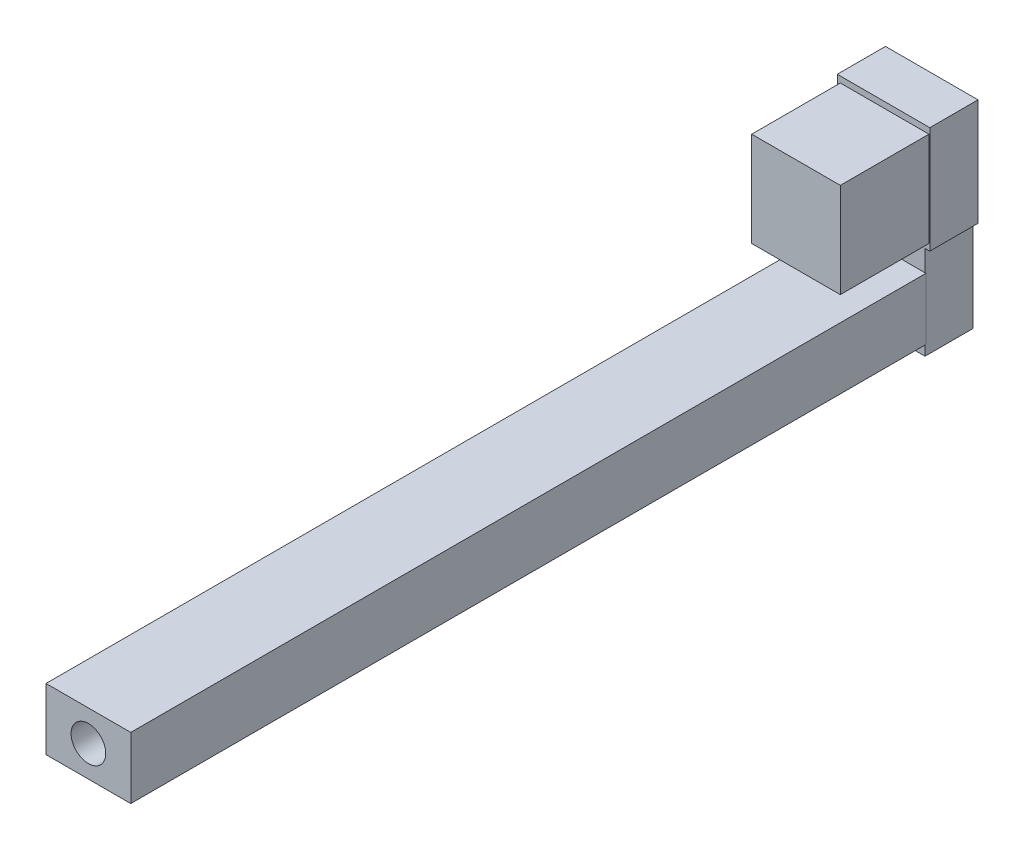
ISO-10303-21;
HEADER;
FILE_DESCRIPTION(('STEP AP214'),'2;1');
FILE_NAME('part.step','',(''),(''),'','','');
FILE_SCHEMA(('AUTOMOTIVE_DESIGN { 1 0 10303 214 1 1 1 1 }'));
ENDSEC;
DATA;
#1=APPLICATION_CONTEXT('core data for automotive mechanical design processes');
#2=APPLICATION_PROTOCOL_DEFINITION('international standard','automotive_design',2000,#1);
#3=PRODUCT_CONTEXT('',#1,'mechanical');
#4=PRODUCT('Part','Part','',(#3));
#5=PRODUCT_RELATED_PRODUCT_CATEGORY('part','',(#4));
#6=PRODUCT_DEFINITION_FORMATION('','',#4);
#7=PRODUCT_DEFINITION_CONTEXT('part definition',#1,'design');
#8=PRODUCT_DEFINITION('design','',#6,#7);
#9=PRODUCT_DEFINITION_SHAPE('','',#8);
#10=(LENGTH_UNIT() NAMED_UNIT(*) SI_UNIT(.MILLI.,.METRE.));
#11=(NAMED_UNIT(*) PLANE_ANGLE_UNIT() SI_UNIT($,.RADIAN.));
#12=(NAMED_UNIT(*) SI_UNIT($,.STERADIAN.) SOLID_ANGLE_UNIT());
#13=UNCERTAINTY_MEASURE_WITH_UNIT(LENGTH_MEASURE(1.E-05),#10,'distance_accuracy_value','');
#14=(GEOMETRIC_REPRESENTATION_CONTEXT(3) GLOBAL_UNCERTAINTY_ASSIGNED_CONTEXT((#13)) GLOBAL_UNIT_ASSIGNED_CONTEXT((#10,
#11,#12)) REPRESENTATION_CONTEXT('',''));
#15=CARTESIAN_POINT('',(0.,0.,0.));
#16=DIRECTION('',(0.,0.,1.));
#17=DIRECTION('',(1.,0.,0.));
#18=AXIS2_PLACEMENT_3D('',#15,#16,#17);
#19=CARTESIAN_POINT('',(68.326,0.,0.));
#20=DIRECTION('',(0.,0.,-1.));
#21=DIRECTION('',(0.,1.,0.));
#22=AXIS2_PLACEMENT_3D('',#19,#20,#21);
#23=PLANE('',#22);
#24=DIRECTION('',(-1.,0.,0.));
#25=VECTOR('',#24,1.);
#26=CARTESIAN_POINT('',(69.85,50.8000000000002,0.));
#27=LINE('',#26,#25);
#28=CARTESIAN_POINT('',(68.326,50.8000000000002,0.));
#29=VERTEX_POINT('',#28);
#30=CARTESIAN_POINT('',(-68.326,50.8000000000002,0.));
#31=VERTEX_POINT('',#30);
#32=EDGE_CURVE('E277',#29,#31,#27,.T.);
#33=ORIENTED_EDGE('',*,*,#32,.F.);
#34=DIRECTION('',(0.,-1.,0.));
#35=VECTOR('',#34,1.);
#36=CARTESIAN_POINT('',(68.326,85.598,0.));
#37=LINE('',#36,#35);
#38=CARTESIAN_POINT('',(68.326,85.598,0.));
#39=VERTEX_POINT('',#38);
#40=EDGE_CURVE('E228',#39,#29,#37,.T.);
#41=ORIENTED_EDGE('',*,*,#40,.F.);
#42=DIRECTION('',(-1.,0.,0.));
#43=VECTOR('',#42,1.);
#44=CARTESIAN_POINT('',(76.23,85.598,0.));
#45=LINE('',#44,#43);
#46=CARTESIAN_POINT('',(76.23,85.598,0.));
#47=VERTEX_POINT('',#46);
#48=EDGE_CURVE('E217',#47,#39,#45,.T.);
#49=ORIENTED_EDGE('',*,*,#48,.F.);
#50=DIRECTION('',(0.,-1.,0.));
#51=VECTOR('',#50,1.);
#52=CARTESIAN_POINT('',(76.23,85.598,0.));
#53=LINE('',#52,#51);
#54=CARTESIAN_POINT('',(76.23,261.868,0.));
#55=VERTEX_POINT('',#54);
#56=EDGE_CURVE('E191',#55,#47,#53,.T.);
#57=ORIENTED_EDGE('',*,*,#56,.F.);
#58=DIRECTION('',(-1.,0.,0.));
#59=VECTOR('',#58,1.);
#60=CARTESIAN_POINT('',(76.23,261.868,0.));
#61=LINE('',#60,#59);
#62=CARTESIAN_POINT('',(-76.23,261.868,0.));
#63=VERTEX_POINT('',#62);
#64=EDGE_CURVE('E200',#55,#63,#61,.T.);
#65=ORIENTED_EDGE('',*,*,#64,.T.);
#66=DIRECTION('',(0.,-1.,0.));
#67=VECTOR('',#66,1.);
#68=CARTESIAN_POINT('',(-76.23,85.598,0.));
#69=LINE('',#68,#67);
#70=CARTESIAN_POINT('',(-76.23,85.598,0.));
#71=VERTEX_POINT('',#70);
#72=EDGE_CURVE('E182',#63,#71,#69,.T.);
#73=ORIENTED_EDGE('',*,*,#72,.T.);
#74=CARTESIAN_POINT('',(-68.326,85.598,0.));
#75=VERTEX_POINT('',#74);
#76=EDGE_CURVE('E216',#75,#71,#45,.T.);
#77=ORIENTED_EDGE('',*,*,#76,.F.);
#78=DIRECTION('',(0.,-1.,0.));
#79=VECTOR('',#78,1.);
#80=CARTESIAN_POINT('',(-68.326,0.,0.));
#81=LINE('',#80,#79);
#82=EDGE_CURVE('E44',#75,#31,#81,.T.);
#83=ORIENTED_EDGE('',*,*,#82,.T.);
#84=EDGE_LOOP('',(#33,#41,#49,#57,#65,#73,#77,#83));
#85=FACE_BOUND('',#84,.T.);
#86=DIRECTION('',(0.,-1.,0.));
#87=VECTOR('',#86,1.);
#88=CARTESIAN_POINT('',(-71.23,251.868,0.));
#89=LINE('',#88,#87);
#90=CARTESIAN_POINT('',(-71.23,251.868,0.));
#91=VERTEX_POINT('',#90);
#92=CARTESIAN_POINT('',(-71.23,95.828,0.));
#93=VERTEX_POINT('',#92);
#94=EDGE_CURVE('E181',#91,#93,#89,.T.);
#95=ORIENTED_EDGE('',*,*,#94,.F.);
#96=DIRECTION('',(-1.,0.,0.));
#97=VECTOR('',#96,1.);
#98=CARTESIAN_POINT('',(-71.23,251.868,0.));
#99=LINE('',#98,#97);
#100=CARTESIAN_POINT('',(74.81,251.868,0.));
#101=VERTEX_POINT('',#100);
#102=EDGE_CURVE('E178',#101,#91,#99,.T.);
#103=ORIENTED_EDGE('',*,*,#102,.F.);
#104=DIRECTION('',(0.,1.,0.));
#105=VECTOR('',#104,1.);
#106=CARTESIAN_POINT('',(74.81,251.868,0.));
#107=LINE('',#106,#105);
#108=CARTESIAN_POINT('',(74.81,95.828,0.));
#109=VERTEX_POINT('',#108);
#110=EDGE_CURVE('E57',#109,#101,#107,.T.);
#111=ORIENTED_EDGE('',*,*,#110,.F.);
#112=DIRECTION('',(1.,0.,0.));
#113=VECTOR('',#112,1.);
#114=CARTESIAN_POINT('',(-71.23,95.828,0.));
#115=LINE('',#114,#113);
#116=EDGE_CURVE('E52',#93,#109,#115,.T.);
#117=ORIENTED_EDGE('',*,*,#116,.F.);
#118=EDGE_LOOP('',(#95,#103,#111,#117));
#119=FACE_BOUND('',#118,.T.);
#120=ADVANCED_FACE('F33',(#85,#119),#23,.F.);
#121=CARTESIAN_POINT('',(69.85,50.8000000000002,0.));
#122=DIRECTION('',(0.,0.,1.));
#123=DIRECTION('',(0.,-1.,0.));
#124=AXIS2_PLACEMENT_3D('',#121,#122,#123);
#125=PLANE('',#124);
#126=CARTESIAN_POINT('',(68.326,-50.8000000000002,0.));
#127=VERTEX_POINT('',#126);
#128=EDGE_CURVE('E42',#29,#127,#37,.T.);
#129=ORIENTED_EDGE('',*,*,#128,.F.);
#130=CARTESIAN_POINT('',(69.85,50.8000000000002,0.));
#131=VERTEX_POINT('',#130);
#132=EDGE_CURVE('E37',#131,#29,#27,.T.);
#133=ORIENTED_EDGE('',*,*,#132,.F.);
#134=DIRECTION('',(0.,1.,0.));
#135=VECTOR('',#134,1.);
#136=CARTESIAN_POINT('',(69.85,50.8000000000002,0.));
#137=LINE('',#136,#135);
#138=CARTESIAN_POINT('',(69.85,-50.8000000000002,0.));
#139=VERTEX_POINT('',#138);
#140=EDGE_CURVE('E246',#139,#131,#137,.T.);
#141=ORIENTED_EDGE('',*,*,#140,.F.);
#142=DIRECTION('',(-1.,0.,0.));
#143=VECTOR('',#142,1.);
#144=CARTESIAN_POINT('',(69.85,-50.8000000000002,0.));
#145=LINE('',#144,#143);
#146=EDGE_CURVE('E265',#139,#127,#145,.T.);
#147=ORIENTED_EDGE('',*,*,#146,.T.);
#148=EDGE_LOOP('',(#129,#133,#141,#147));
#149=FACE_BOUND('',#148,.T.);
#150=ADVANCED_FACE('F333',(#149),#125,.F.);
#151=CARTESIAN_POINT('',(-69.85,50.8000000000002,0.));
#152=VERTEX_POINT('',#151);
#153=EDGE_CURVE('E272',#31,#152,#27,.T.);
#154=ORIENTED_EDGE('',*,*,#153,.F.);
#155=CARTESIAN_POINT('',(-68.326,-50.8000000000002,0.));
#156=VERTEX_POINT('',#155);
#157=EDGE_CURVE('E11',#31,#156,#81,.T.);
#158=ORIENTED_EDGE('',*,*,#157,.T.);
#159=CARTESIAN_POINT('',(-69.85,-50.8000000000002,0.));
#160=VERTEX_POINT('',#159);
#161=EDGE_CURVE('E256',#156,#160,#145,.T.);
#162=ORIENTED_EDGE('',*,*,#161,.T.);
#163=DIRECTION('',(0.,1.,0.));
#164=VECTOR('',#163,1.);
#165=CARTESIAN_POINT('',(-69.85,50.8000000000002,0.));
#166=LINE('',#165,#164);
#167=EDGE_CURVE('E245',#160,#152,#166,.T.);
#168=ORIENTED_EDGE('',*,*,#167,.T.);
#169=EDGE_LOOP('',(#154,#158,#162,#168));
#170=FACE_BOUND('',#169,.T.);
#171=ADVANCED_FACE('F35',(#170),#125,.F.);
#172=CARTESIAN_POINT('',(69.85,50.8000000000002,0.));
#173=DIRECTION('',(0.,-1.,0.));
#174=DIRECTION('',(0.,0.,-1.));
#175=AXIS2_PLACEMENT_3D('',#172,#173,#174);
#176=PLANE('',#175);
#177=DIRECTION('',(0.,0.,1.));
#178=VECTOR('',#177,1.);
#179=CARTESIAN_POINT('',(-69.85,50.8000000000002,0.));
#180=LINE('',#179,#178);
#181=CARTESIAN_POINT('',(-69.85,50.7999999999996,1310.386));
#182=VERTEX_POINT('',#181);
#183=EDGE_CURVE('E259',#152,#182,#180,.T.);
#184=ORIENTED_EDGE('',*,*,#183,.T.);
#185=DIRECTION('',(-1.,0.,0.));
#186=VECTOR('',#185,1.);
#187=CARTESIAN_POINT('',(69.85,50.7999999999996,1310.386));
#188=LINE('',#187,#186);
#189=CARTESIAN_POINT('',(69.85,50.7999999999996,1310.386));
#190=VERTEX_POINT('',#189);
#191=EDGE_CURVE('E270',#190,#182,#188,.T.);
#192=ORIENTED_EDGE('',*,*,#191,.F.);
#193=DIRECTION('',(0.,0.,1.));
#194=VECTOR('',#193,1.);
#195=CARTESIAN_POINT('',(69.85,50.8000000000002,0.));
#196=LINE('',#195,#194);
#197=EDGE_CURVE('E249',#131,#190,#196,.T.);
#198=ORIENTED_EDGE('',*,*,#197,.F.);
#199=ORIENTED_EDGE('',*,*,#132,.T.);
#200=ORIENTED_EDGE('',*,*,#32,.T.);
#201=ORIENTED_EDGE('',*,*,#153,.T.);
#202=EDGE_LOOP('',(#184,#192,#198,#199,#200,#201));
#203=FACE_BOUND('',#202,.T.);
#204=ADVANCED_FACE('F312',(#203),#176,.F.);
#205=CARTESIAN_POINT('',(69.85,50.7999999999996,1310.386));
#206=DIRECTION('',(0.,0.,-1.));
#207=DIRECTION('',(-1.,0.,0.));
#208=AXIS2_PLACEMENT_3D('',#205,#206,#207);
#209=PLANE('',#208);
#210=CARTESIAN_POINT('',(0.,0.,1310.386));
#211=DIRECTION('',(0.,0.,1.));
#212=DIRECTION('',(1.,0.,0.));
#213=AXIS2_PLACEMENT_3D('',#210,#211,#212);
#214=CIRCLE('',#213,28.575);
#215=CARTESIAN_POINT('',(28.575,0.,1310.386));
#216=VERTEX_POINT('',#215);
#217=EDGE_CURVE('E554',#216,#216,#214,.T.);
#218=ORIENTED_EDGE('',*,*,#217,.F.);
#219=EDGE_LOOP('',(#218));
#220=FACE_BOUND('',#219,.T.);
#221=DIRECTION('',(0.,-1.,0.));
#222=VECTOR('',#221,1.);
#223=CARTESIAN_POINT('',(-69.85,50.7999999999996,1310.386));
#224=LINE('',#223,#222);
#225=CARTESIAN_POINT('',(-69.85,-50.8000000000004,1310.386));
#226=VERTEX_POINT('',#225);
#227=EDGE_CURVE('E261',#182,#226,#224,.T.);
#228=ORIENTED_EDGE('',*,*,#227,.T.);
#229=DIRECTION('',(-1.,0.,0.));
#230=VECTOR('',#229,1.);
#231=CARTESIAN_POINT('',(69.85,-50.8000000000004,1310.386));
#232=LINE('',#231,#230);
#233=CARTESIAN_POINT('',(69.85,-50.8000000000004,1310.386));
#234=VERTEX_POINT('',#233);
#235=EDGE_CURVE('E267',#234,#226,#232,.T.);
#236=ORIENTED_EDGE('',*,*,#235,.F.);
#237=DIRECTION('',(0.,-1.,0.));
#238=VECTOR('',#237,1.);
#239=CARTESIAN_POINT('',(69.85,50.7999999999996,1310.386));
#240=LINE('',#239,#238);
#241=EDGE_CURVE('E252',#190,#234,#240,.T.);
#242=ORIENTED_EDGE('',*,*,#241,.F.);
#243=ORIENTED_EDGE('',*,*,#191,.T.);
#244=EDGE_LOOP('',(#228,#236,#242,#243));
#245=FACE_BOUND('',#244,.T.);
#246=ADVANCED_FACE('F328',(#220,#245),#209,.F.);
#247=CARTESIAN_POINT('',(69.85,-50.8000000000002,0.));
#248=DIRECTION('',(0.,1.,0.));
#249=DIRECTION('',(0.,0.,1.));
#250=AXIS2_PLACEMENT_3D('',#247,#248,#249);
#251=PLANE('',#250);
#252=DIRECTION('',(0.,0.,-1.));
#253=VECTOR('',#252,1.);
#254=CARTESIAN_POINT('',(-69.85,-50.8000000000002,0.));
#255=LINE('',#254,#253);
#256=EDGE_CURVE('E250',#226,#160,#255,.T.);
#257=ORIENTED_EDGE('',*,*,#256,.T.);
#258=ORIENTED_EDGE('',*,*,#161,.F.);
#259=EDGE_CURVE('E268',#127,#156,#145,.T.);
#260=ORIENTED_EDGE('',*,*,#259,.F.);
#261=ORIENTED_EDGE('',*,*,#146,.F.);
#262=DIRECTION('',(0.,0.,-1.));
#263=VECTOR('',#262,1.);
#264=CARTESIAN_POINT('',(69.85,-50.8000000000002,0.));
#265=LINE('',#264,#263);
#266=EDGE_CURVE('E254',#234,#139,#265,.T.);
#267=ORIENTED_EDGE('',*,*,#266,.F.);
#268=ORIENTED_EDGE('',*,*,#235,.T.);
#269=EDGE_LOOP('',(#257,#258,#260,#261,#267,#268));
#270=FACE_BOUND('',#269,.T.);
#271=ADVANCED_FACE('F320',(#270),#251,.F.);
#272=CARTESIAN_POINT('',(69.85,0.,0.));
#273=DIRECTION('',(-1.,0.,0.));
#274=DIRECTION('',(0.,0.,1.));
#275=AXIS2_PLACEMENT_3D('',#272,#273,#274);
#276=PLANE('',#275);
#277=ORIENTED_EDGE('',*,*,#140,.T.);
#278=ORIENTED_EDGE('',*,*,#197,.T.);
#279=ORIENTED_EDGE('',*,*,#241,.T.);
#280=ORIENTED_EDGE('',*,*,#266,.T.);
#281=EDGE_LOOP('',(#277,#278,#279,#280));
#282=FACE_BOUND('',#281,.T.);
#283=ADVANCED_FACE('F330',(#282),#276,.F.);
#284=CARTESIAN_POINT('',(-69.85,0.,0.));
#285=DIRECTION('',(-1.,0.,0.));
#286=DIRECTION('',(0.,0.,1.));
#287=AXIS2_PLACEMENT_3D('',#284,#285,#286);
#288=PLANE('',#287);
#289=ORIENTED_EDGE('',*,*,#167,.F.);
#290=ORIENTED_EDGE('',*,*,#256,.F.);
#291=ORIENTED_EDGE('',*,*,#227,.F.);
#292=ORIENTED_EDGE('',*,*,#183,.F.);
#293=EDGE_LOOP('',(#289,#290,#291,#292));
#294=FACE_BOUND('',#293,.T.);
#295=ADVANCED_FACE('F327',(#294),#288,.T.);
#296=CARTESIAN_POINT('',(68.326,-68.326,0.));
#297=VERTEX_POINT('',#296);
#298=EDGE_CURVE('E227',#127,#297,#37,.T.);
#299=ORIENTED_EDGE('',*,*,#298,.F.);
#300=ORIENTED_EDGE('',*,*,#259,.T.);
#301=CARTESIAN_POINT('',(-68.326,-68.326,0.));
#302=VERTEX_POINT('',#301);
#303=EDGE_CURVE('E45',#156,#302,#81,.T.);
#304=ORIENTED_EDGE('',*,*,#303,.T.);
#305=DIRECTION('',(-1.,0.,0.));
#306=VECTOR('',#305,1.);
#307=CARTESIAN_POINT('',(68.326,-68.326,0.));
#308=LINE('',#307,#306);
#309=EDGE_CURVE('E242',#297,#302,#308,.T.);
#310=ORIENTED_EDGE('',*,*,#309,.F.);
#311=EDGE_LOOP('',(#299,#300,#304,#310));
#312=FACE_BOUND('',#311,.T.);
#313=ADVANCED_FACE('F293',(#312),#23,.F.);
#314=CARTESIAN_POINT('',(68.326,-68.326,-79.4308383840396));
#315=DIRECTION('',(0.,0.,1.));
#316=DIRECTION('',(1.,0.,0.));
#317=AXIS2_PLACEMENT_3D('',#314,#315,#316);
#318=PLANE('',#317);
#319=DIRECTION('',(0.,1.,0.));
#320=VECTOR('',#319,1.);
#321=CARTESIAN_POINT('',(-68.326,-68.326,-79.4308383840396));
#322=LINE('',#321,#320);
#323=CARTESIAN_POINT('',(-68.326,-68.326,-79.4308383840396));
#324=VERTEX_POINT('',#323);
#325=CARTESIAN_POINT('',(-68.326,85.598,-79.4308383840396));
#326=VERTEX_POINT('',#325);
#327=EDGE_CURVE('E219',#324,#326,#322,.T.);
#328=ORIENTED_EDGE('',*,*,#327,.T.);
#329=DIRECTION('',(-1.,0.,0.));
#330=VECTOR('',#329,1.);
#331=CARTESIAN_POINT('',(76.23,85.598,-79.4308383840396));
#332=LINE('',#331,#330);
#333=CARTESIAN_POINT('',(-76.23,85.598,-79.4308383840396));
#334=VERTEX_POINT('',#333);
#335=EDGE_CURVE('E212',#326,#334,#332,.T.);
#336=ORIENTED_EDGE('',*,*,#335,.T.);
#337=DIRECTION('',(0.,1.,0.));
#338=VECTOR('',#337,1.);
#339=CARTESIAN_POINT('',(-76.23,85.598,-79.4308383840396));
#340=LINE('',#339,#338);
#341=CARTESIAN_POINT('',(-76.23,261.868,-79.4308383840396));
#342=VERTEX_POINT('',#341);
#343=EDGE_CURVE('E204',#334,#342,#340,.T.);
#344=ORIENTED_EDGE('',*,*,#343,.T.);
#345=DIRECTION('',(-1.,0.,0.));
#346=VECTOR('',#345,1.);
#347=CARTESIAN_POINT('',(76.23,261.868,-79.4308383840396));
#348=LINE('',#347,#346);
#349=CARTESIAN_POINT('',(76.23,261.868,-79.4308383840396));
#350=VERTEX_POINT('',#349);
#351=EDGE_CURVE('E209',#350,#342,#348,.T.);
#352=ORIENTED_EDGE('',*,*,#351,.F.);
#353=DIRECTION('',(0.,1.,0.));
#354=VECTOR('',#353,1.);
#355=CARTESIAN_POINT('',(76.23,85.598,-79.4308383840396));
#356=LINE('',#355,#354);
#357=CARTESIAN_POINT('',(76.23,85.598,-79.4308383840396));
#358=VERTEX_POINT('',#357);
#359=EDGE_CURVE('E197',#358,#350,#356,.T.);
#360=ORIENTED_EDGE('',*,*,#359,.F.);
#361=CARTESIAN_POINT('',(68.326,85.598,-79.4308383840396));
#362=VERTEX_POINT('',#361);
#363=EDGE_CURVE('E213',#358,#362,#332,.T.);
#364=ORIENTED_EDGE('',*,*,#363,.T.);
#365=DIRECTION('',(0.,1.,0.));
#366=VECTOR('',#365,1.);
#367=CARTESIAN_POINT('',(68.326,-68.326,-79.4308383840396));
#368=LINE('',#367,#366);
#369=CARTESIAN_POINT('',(68.326,-68.326,-79.4308383840396));
#370=VERTEX_POINT('',#369);
#371=EDGE_CURVE('E220',#370,#362,#368,.T.);
#372=ORIENTED_EDGE('',*,*,#371,.F.);
#373=DIRECTION('',(-1.,0.,0.));
#374=VECTOR('',#373,1.);
#375=CARTESIAN_POINT('',(68.326,-68.326,-79.4308383840396));
#376=LINE('',#375,#374);
#377=EDGE_CURVE('E233',#370,#324,#376,.T.);
#378=ORIENTED_EDGE('',*,*,#377,.T.);
#379=EDGE_LOOP('',(#328,#336,#344,#352,#360,#364,#372,#378));
#380=FACE_BOUND('',#379,.T.);
#381=ADVANCED_FACE('F301',(#380),#318,.F.);
#382=CARTESIAN_POINT('',(68.326,-68.326,0.));
#383=DIRECTION('',(0.,1.,0.));
#384=DIRECTION('',(0.,0.,1.));
#385=AXIS2_PLACEMENT_3D('',#382,#383,#384);
#386=PLANE('',#385);
#387=DIRECTION('',(0.,0.,-1.));
#388=VECTOR('',#387,1.);
#389=CARTESIAN_POINT('',(-68.326,-68.326,0.));
#390=LINE('',#389,#388);
#391=EDGE_CURVE('E224',#302,#324,#390,.T.);
#392=ORIENTED_EDGE('',*,*,#391,.T.);
#393=ORIENTED_EDGE('',*,*,#377,.F.);
#394=DIRECTION('',(0.,0.,-1.));
#395=VECTOR('',#394,1.);
#396=CARTESIAN_POINT('',(68.326,-68.326,0.));
#397=LINE('',#396,#395);
#398=EDGE_CURVE('E231',#297,#370,#397,.T.);
#399=ORIENTED_EDGE('',*,*,#398,.F.);
#400=ORIENTED_EDGE('',*,*,#309,.T.);
#401=EDGE_LOOP('',(#392,#393,#399,#400));
#402=FACE_BOUND('',#401,.T.);
#403=ADVANCED_FACE('F297',(#402),#386,.F.);
#404=CARTESIAN_POINT('',(68.326,0.,0.));
#405=DIRECTION('',(1.,0.,0.));
#406=DIRECTION('',(0.,0.,-1.));
#407=AXIS2_PLACEMENT_3D('',#404,#405,#406);
#408=PLANE('',#407);
#409=ORIENTED_EDGE('',*,*,#371,.T.);
#410=DIRECTION('',(0.,0.,1.));
#411=VECTOR('',#410,1.);
#412=CARTESIAN_POINT('',(68.326,85.598,-79.4308383840396));
#413=LINE('',#412,#411);
#414=EDGE_CURVE('E223',#362,#39,#413,.T.);
#415=ORIENTED_EDGE('',*,*,#414,.T.);
#416=ORIENTED_EDGE('',*,*,#40,.T.);
#417=ORIENTED_EDGE('',*,*,#128,.T.);
#418=ORIENTED_EDGE('',*,*,#298,.T.);
#419=ORIENTED_EDGE('',*,*,#398,.T.);
#420=EDGE_LOOP('',(#409,#415,#416,#417,#418,#419));
#421=FACE_BOUND('',#420,.T.);
#422=ADVANCED_FACE('F288',(#421),#408,.T.);
#423=CARTESIAN_POINT('',(-68.326,0.,0.));
#424=DIRECTION('',(1.,0.,0.));
#425=DIRECTION('',(0.,0.,-1.));
#426=AXIS2_PLACEMENT_3D('',#423,#424,#425);
#427=PLANE('',#426);
#428=ORIENTED_EDGE('',*,*,#327,.F.);
#429=ORIENTED_EDGE('',*,*,#391,.F.);
#430=ORIENTED_EDGE('',*,*,#303,.F.);
#431=ORIENTED_EDGE('',*,*,#157,.F.);
#432=ORIENTED_EDGE('',*,*,#82,.F.);
#433=DIRECTION('',(0.,0.,1.));
#434=VECTOR('',#433,1.);
#435=CARTESIAN_POINT('',(-68.326,85.598,-79.4308383840396));
#436=LINE('',#435,#434);
#437=EDGE_CURVE('E236',#326,#75,#436,.T.);
#438=ORIENTED_EDGE('',*,*,#437,.F.);
#439=EDGE_LOOP('',(#428,#429,#430,#431,#432,#438));
#440=FACE_BOUND('',#439,.T.);
#441=ADVANCED_FACE('F314',(#440),#427,.F.);
#442=CARTESIAN_POINT('',(76.23,85.598,0.));
#443=DIRECTION('',(0.,1.,0.));
#444=DIRECTION('',(0.,0.,1.));
#445=AXIS2_PLACEMENT_3D('',#442,#443,#444);
#446=PLANE('',#445);
#447=ORIENTED_EDGE('',*,*,#335,.F.);
#448=ORIENTED_EDGE('',*,*,#437,.T.);
#449=ORIENTED_EDGE('',*,*,#76,.T.);
#450=DIRECTION('',(0.,0.,-1.));
#451=VECTOR('',#450,1.);
#452=CARTESIAN_POINT('',(-76.23,85.598,0.));
#453=LINE('',#452,#451);
#454=EDGE_CURVE('E185',#71,#334,#453,.T.);
#455=ORIENTED_EDGE('',*,*,#454,.T.);
#456=EDGE_LOOP('',(#447,#448,#449,#455));
#457=FACE_BOUND('',#456,.T.);
#458=ADVANCED_FACE('F433',(#457),#446,.F.);
#459=ORIENTED_EDGE('',*,*,#414,.F.);
#460=ORIENTED_EDGE('',*,*,#363,.F.);
#461=DIRECTION('',(0.,0.,-1.));
#462=VECTOR('',#461,1.);
#463=CARTESIAN_POINT('',(76.23,85.598,0.));
#464=LINE('',#463,#462);
#465=EDGE_CURVE('E194',#47,#358,#464,.T.);
#466=ORIENTED_EDGE('',*,*,#465,.F.);
#467=ORIENTED_EDGE('',*,*,#48,.T.);
#468=EDGE_LOOP('',(#459,#460,#466,#467));
#469=FACE_BOUND('',#468,.T.);
#470=ADVANCED_FACE('F441',(#469),#446,.F.);
#471=CARTESIAN_POINT('',(76.23,261.868,0.));
#472=DIRECTION('',(0.,-1.,0.));
#473=DIRECTION('',(0.,0.,-1.));
#474=AXIS2_PLACEMENT_3D('',#471,#472,#473);
#475=PLANE('',#474);
#476=DIRECTION('',(0.,0.,1.));
#477=VECTOR('',#476,1.);
#478=CARTESIAN_POINT('',(-76.23,261.868,0.));
#479=LINE('',#478,#477);
#480=EDGE_CURVE('E195',#342,#63,#479,.T.);
#481=ORIENTED_EDGE('',*,*,#480,.T.);
#482=ORIENTED_EDGE('',*,*,#64,.F.);
#483=DIRECTION('',(0.,0.,1.));
#484=VECTOR('',#483,1.);
#485=CARTESIAN_POINT('',(76.23,261.868,0.));
#486=LINE('',#485,#484);
#487=EDGE_CURVE('E199',#350,#55,#486,.T.);
#488=ORIENTED_EDGE('',*,*,#487,.F.);
#489=ORIENTED_EDGE('',*,*,#351,.T.);
#490=EDGE_LOOP('',(#481,#482,#488,#489));
#491=FACE_BOUND('',#490,.T.);
#492=ADVANCED_FACE('F451',(#491),#475,.F.);
#493=CARTESIAN_POINT('',(76.23,0.,0.));
#494=DIRECTION('',(-1.,0.,0.));
#495=DIRECTION('',(0.,0.,1.));
#496=AXIS2_PLACEMENT_3D('',#493,#494,#495);
#497=PLANE('',#496);
#498=ORIENTED_EDGE('',*,*,#56,.T.);
#499=ORIENTED_EDGE('',*,*,#465,.T.);
#500=ORIENTED_EDGE('',*,*,#359,.T.);
#501=ORIENTED_EDGE('',*,*,#487,.T.);
#502=EDGE_LOOP('',(#498,#499,#500,#501));
#503=FACE_BOUND('',#502,.T.);
#504=ADVANCED_FACE('F459',(#503),#497,.F.);
#505=CARTESIAN_POINT('',(-76.23,0.,0.));
#506=DIRECTION('',(-1.,0.,0.));
#507=DIRECTION('',(0.,0.,1.));
#508=AXIS2_PLACEMENT_3D('',#505,#506,#507);
#509=PLANE('',#508);
#510=ORIENTED_EDGE('',*,*,#72,.F.);
#511=ORIENTED_EDGE('',*,*,#480,.F.);
#512=ORIENTED_EDGE('',*,*,#343,.F.);
#513=ORIENTED_EDGE('',*,*,#454,.F.);
#514=EDGE_LOOP('',(#510,#511,#512,#513));
#515=FACE_BOUND('',#514,.T.);
#516=ADVANCED_FACE('F469',(#515),#509,.T.);
#517=CARTESIAN_POINT('',(-71.23,251.868,146.05));
#518=DIRECTION('',(1.,0.,0.));
#519=DIRECTION('',(0.,0.,-1.));
#520=AXIS2_PLACEMENT_3D('',#517,#518,#519);
#521=PLANE('',#520);
#522=ORIENTED_EDGE('',*,*,#94,.T.);
#523=DIRECTION('',(0.,0.,-1.));
#524=VECTOR('',#523,1.);
#525=CARTESIAN_POINT('',(-71.23,95.828,146.05));
#526=LINE('',#525,#524);
#527=CARTESIAN_POINT('',(-71.23,95.828,146.05));
#528=VERTEX_POINT('',#527);
#529=EDGE_CURVE('E162',#528,#93,#526,.T.);
#530=ORIENTED_EDGE('',*,*,#529,.F.);
#531=DIRECTION('',(0.,-1.,0.));
#532=VECTOR('',#531,1.);
#533=CARTESIAN_POINT('',(-71.23,251.868,146.05));
#534=LINE('',#533,#532);
#535=CARTESIAN_POINT('',(-71.23,251.868,146.05));
#536=VERTEX_POINT('',#535);
#537=EDGE_CURVE('E169',#536,#528,#534,.T.);
#538=ORIENTED_EDGE('',*,*,#537,.F.);
#539=DIRECTION('',(0.,0.,-1.));
#540=VECTOR('',#539,1.);
#541=CARTESIAN_POINT('',(-71.23,251.868,146.05));
#542=LINE('',#541,#540);
#543=EDGE_CURVE('E561',#536,#91,#542,.T.);
#544=ORIENTED_EDGE('',*,*,#543,.T.);
#545=EDGE_LOOP('',(#522,#530,#538,#544));
#546=FACE_BOUND('',#545,.T.);
#547=ADVANCED_FACE('F180',(#546),#521,.F.);
#548=CARTESIAN_POINT('',(-71.23,95.828,146.05));
#549=DIRECTION('',(0.,1.,0.));
#550=DIRECTION('',(0.,0.,1.));
#551=AXIS2_PLACEMENT_3D('',#548,#549,#550);
#552=PLANE('',#551);
#553=ORIENTED_EDGE('',*,*,#116,.T.);
#554=DIRECTION('',(0.,0.,-1.));
#555=VECTOR('',#554,1.);
#556=CARTESIAN_POINT('',(74.81,95.828,146.05));
#557=LINE('',#556,#555);
#558=CARTESIAN_POINT('',(74.81,95.828,146.05));
#559=VERTEX_POINT('',#558);
#560=EDGE_CURVE('E165',#559,#109,#557,.T.);
#561=ORIENTED_EDGE('',*,*,#560,.F.);
#562=DIRECTION('',(1.,0.,0.));
#563=VECTOR('',#562,1.);
#564=CARTESIAN_POINT('',(-71.23,95.828,146.05));
#565=LINE('',#564,#563);
#566=EDGE_CURVE('E158',#528,#559,#565,.T.);
#567=ORIENTED_EDGE('',*,*,#566,.F.);
#568=ORIENTED_EDGE('',*,*,#529,.T.);
#569=EDGE_LOOP('',(#553,#561,#567,#568));
#570=FACE_BOUND('',#569,.T.);
#571=ADVANCED_FACE('F160',(#570),#552,.F.);
#572=CARTESIAN_POINT('',(74.81,251.868,146.05));
#573=DIRECTION('',(-1.,0.,0.));
#574=DIRECTION('',(0.,-1.,0.));
#575=AXIS2_PLACEMENT_3D('',#572,#573,#574);
#576=PLANE('',#575);
#577=ORIENTED_EDGE('',*,*,#110,.T.);
#578=DIRECTION('',(0.,0.,-1.));
#579=VECTOR('',#578,1.);
#580=CARTESIAN_POINT('',(74.81,251.868,146.05));
#581=LINE('',#580,#579);
#582=CARTESIAN_POINT('',(74.81,251.868,146.05));
#583=VERTEX_POINT('',#582);
#584=EDGE_CURVE('E187',#583,#101,#581,.T.);
#585=ORIENTED_EDGE('',*,*,#584,.F.);
#586=DIRECTION('',(0.,1.,0.));
#587=VECTOR('',#586,1.);
#588=CARTESIAN_POINT('',(74.81,251.868,146.05));
#589=LINE('',#588,#587);
#590=EDGE_CURVE('E168',#559,#583,#589,.T.);
#591=ORIENTED_EDGE('',*,*,#590,.F.);
#592=ORIENTED_EDGE('',*,*,#560,.T.);
#593=EDGE_LOOP('',(#577,#585,#591,#592));
#594=FACE_BOUND('',#593,.T.);
#595=ADVANCED_FACE('F502',(#594),#576,.F.);
#596=CARTESIAN_POINT('',(-71.23,251.868,146.05));
#597=DIRECTION('',(0.,-1.,0.));
#598=DIRECTION('',(0.,0.,-1.));
#599=AXIS2_PLACEMENT_3D('',#596,#597,#598);
#600=PLANE('',#599);
#601=ORIENTED_EDGE('',*,*,#102,.T.);
#602=ORIENTED_EDGE('',*,*,#543,.F.);
#603=DIRECTION('',(-1.,0.,0.));
#604=VECTOR('',#603,1.);
#605=CARTESIAN_POINT('',(-71.23,251.868,146.05));
#606=LINE('',#605,#604);
#607=EDGE_CURVE('E174',#583,#536,#606,.T.);
#608=ORIENTED_EDGE('',*,*,#607,.F.);
#609=ORIENTED_EDGE('',*,*,#584,.T.);
#610=EDGE_LOOP('',(#601,#602,#608,#609));
#611=FACE_BOUND('',#610,.T.);
#612=ADVANCED_FACE('F511',(#611),#600,.F.);
#613=CARTESIAN_POINT('',(0.,0.,146.05));
#614=DIRECTION('',(0.,0.,1.));
#615=DIRECTION('',(1.,0.,0.));
#616=AXIS2_PLACEMENT_3D('',#613,#614,#615);
#617=PLANE('',#616);
#618=ORIENTED_EDGE('',*,*,#537,.T.);
#619=ORIENTED_EDGE('',*,*,#566,.T.);
#620=ORIENTED_EDGE('',*,*,#590,.T.);
#621=ORIENTED_EDGE('',*,*,#607,.T.);
#622=EDGE_LOOP('',(#618,#619,#620,#621));
#623=FACE_BOUND('',#622,.T.);
#624=ADVANCED_FACE('F172',(#623),#617,.T.);
#625=CARTESIAN_POINT('',(0.,0.,383.286));
#626=DIRECTION('',(0.,0.,1.));
#627=DIRECTION('',(1.,0.,0.));
#628=AXIS2_PLACEMENT_3D('',#625,#626,#627);
#629=CYLINDRICAL_SURFACE('',#628,28.575);
#630=CARTESIAN_POINT('',(0.,0.,383.286));
#631=DIRECTION('',(0.,0.,1.));
#632=DIRECTION('',(1.,0.,0.));
#633=AXIS2_PLACEMENT_3D('',#630,#631,#632);
#634=CIRCLE('',#633,28.575);
#635=CARTESIAN_POINT('',(28.575,0.,383.286));
#636=VERTEX_POINT('',#635);
#637=EDGE_CURVE('E553',#636,#636,#634,.T.);
#638=ORIENTED_EDGE('',*,*,#637,.F.);
#639=EDGE_LOOP('',(#638));
#640=FACE_BOUND('',#639,.T.);
#641=ORIENTED_EDGE('',*,*,#217,.T.);
#642=EDGE_LOOP('',(#641));
#643=FACE_BOUND('',#642,.T.);
#644=ADVANCED_FACE('F528',(#640,#643),#629,.F.);
#645=CARTESIAN_POINT('',(0.,0.,383.286));
#646=DIRECTION('',(0.,0.,1.));
#647=DIRECTION('',(1.,0.,0.));
#648=AXIS2_PLACEMENT_3D('',#645,#646,#647);
#649=PLANE('',#648);
#650=ORIENTED_EDGE('',*,*,#637,.T.);
#651=EDGE_LOOP('',(#650));
#652=FACE_BOUND('',#651,.T.);
#653=ADVANCED_FACE('F537',(#652),#649,.T.);
#654=CLOSED_SHELL('',(#120,#150,#171,#204,#246,#271,#283,#295,#313,#381,#403,#422,#441,#458,
#470,#492,#504,#516,#547,#571,#595,#612,#624,#644,#653));
#655=MANIFOLD_SOLID_BREP('B2',#654);
#656=ADVANCED_BREP_SHAPE_REPRESENTATION('',(#18,#655),#14);
#657=SHAPE_DEFINITION_REPRESENTATION(#9,#656);
ENDSEC;
END-ISO-10303-21;
